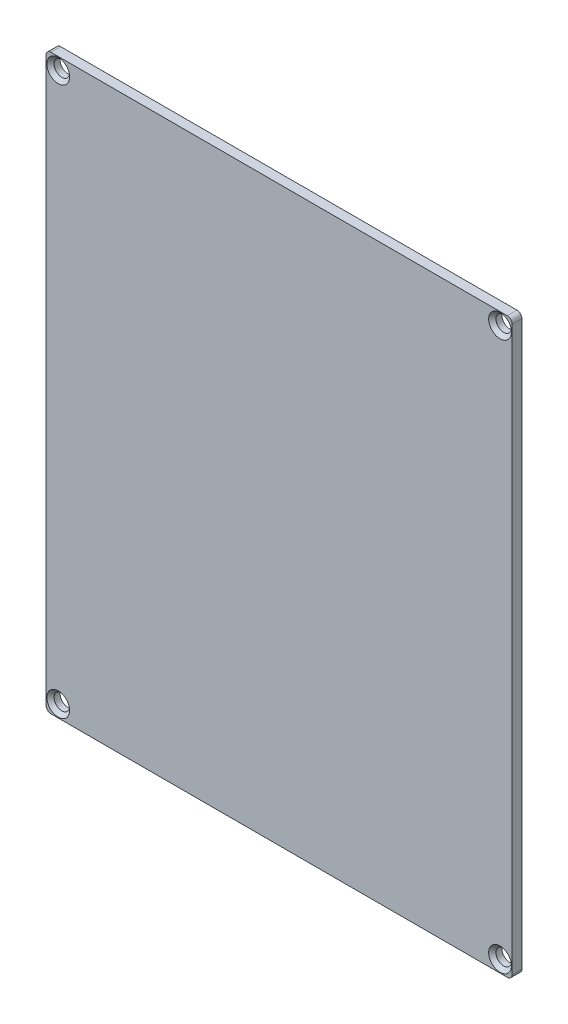
ISO-10303-21;
HEADER;
FILE_DESCRIPTION(('STEP AP214'),'2;1');
FILE_NAME('part.step','',(''),(''),'','','');
FILE_SCHEMA(('AUTOMOTIVE_DESIGN { 1 0 10303 214 1 1 1 1 }'));
ENDSEC;
DATA;
#1=APPLICATION_CONTEXT('core data for automotive mechanical design processes');
#2=APPLICATION_PROTOCOL_DEFINITION('international standard','automotive_design',2000,#1);
#3=PRODUCT_CONTEXT('',#1,'mechanical');
#4=PRODUCT('Part','Part','',(#3));
#5=PRODUCT_RELATED_PRODUCT_CATEGORY('part','',(#4));
#6=PRODUCT_DEFINITION_FORMATION('','',#4);
#7=PRODUCT_DEFINITION_CONTEXT('part definition',#1,'design');
#8=PRODUCT_DEFINITION('design','',#6,#7);
#9=PRODUCT_DEFINITION_SHAPE('','',#8);
#10=(LENGTH_UNIT() NAMED_UNIT(*) SI_UNIT(.MILLI.,.METRE.));
#11=(NAMED_UNIT(*) PLANE_ANGLE_UNIT() SI_UNIT($,.RADIAN.));
#12=(NAMED_UNIT(*) SI_UNIT($,.STERADIAN.) SOLID_ANGLE_UNIT());
#13=UNCERTAINTY_MEASURE_WITH_UNIT(LENGTH_MEASURE(1.E-05),#10,'distance_accuracy_value','');
#14=(GEOMETRIC_REPRESENTATION_CONTEXT(3) GLOBAL_UNCERTAINTY_ASSIGNED_CONTEXT((#13)) GLOBAL_UNIT_ASSIGNED_CONTEXT((#10,
#11,#12)) REPRESENTATION_CONTEXT('',''));
#15=CARTESIAN_POINT('',(0.,0.,0.));
#16=DIRECTION('',(0.,0.,1.));
#17=DIRECTION('',(1.,0.,0.));
#18=AXIS2_PLACEMENT_3D('',#15,#16,#17);
#19=CARTESIAN_POINT('',(0.,0.,2.));
#20=DIRECTION('',(0.,0.,-1.));
#21=DIRECTION('',(-1.,0.,0.));
#22=AXIS2_PLACEMENT_3D('',#19,#20,#21);
#23=PLANE('',#22);
#24=CARTESIAN_POINT('',(45.5,-56.5,2.));
#25=DIRECTION('',(0.,0.,-1.));
#26=DIRECTION('',(-1.,0.,0.));
#27=AXIS2_PLACEMENT_3D('',#24,#25,#26);
#28=CIRCLE('',#27,2.35000000000003);
#29=CARTESIAN_POINT('',(47.85,-56.5,2.));
#30=VERTEX_POINT('',#29);
#31=EDGE_CURVE('E148',#30,#30,#28,.T.);
#32=ORIENTED_EDGE('',*,*,#31,.T.);
#33=EDGE_LOOP('',(#32));
#34=FACE_BOUND('',#33,.T.);
#35=CARTESIAN_POINT('',(-45.5,-56.5,2.));
#36=DIRECTION('',(0.,0.,-1.));
#37=DIRECTION('',(-1.,0.,0.));
#38=AXIS2_PLACEMENT_3D('',#35,#36,#37);
#39=CIRCLE('',#38,2.35000000000003);
#40=CARTESIAN_POINT('',(-43.15,-56.5,2.));
#41=VERTEX_POINT('',#40);
#42=EDGE_CURVE('E145',#41,#41,#39,.T.);
#43=ORIENTED_EDGE('',*,*,#42,.T.);
#44=EDGE_LOOP('',(#43));
#45=FACE_BOUND('',#44,.T.);
#46=CARTESIAN_POINT('',(-45.5,56.5,2.));
#47=DIRECTION('',(0.,0.,-1.));
#48=DIRECTION('',(-1.,0.,0.));
#49=AXIS2_PLACEMENT_3D('',#46,#47,#48);
#50=CIRCLE('',#49,2.35000000000003);
#51=CARTESIAN_POINT('',(-43.15,56.5,2.));
#52=VERTEX_POINT('',#51);
#53=EDGE_CURVE('E142',#52,#52,#50,.T.);
#54=ORIENTED_EDGE('',*,*,#53,.T.);
#55=EDGE_LOOP('',(#54));
#56=FACE_BOUND('',#55,.T.);
#57=CARTESIAN_POINT('',(45.5,56.5,2.));
#58=DIRECTION('',(0.,0.,-1.));
#59=DIRECTION('',(-1.,0.,0.));
#60=AXIS2_PLACEMENT_3D('',#57,#58,#59);
#61=CIRCLE('',#60,2.35000000000003);
#62=CARTESIAN_POINT('',(47.85,56.5,2.));
#63=VERTEX_POINT('',#62);
#64=EDGE_CURVE('E139',#63,#63,#61,.T.);
#65=ORIENTED_EDGE('',*,*,#64,.T.);
#66=EDGE_LOOP('',(#65));
#67=FACE_BOUND('',#66,.T.);
#68=DIRECTION('',(0.,-1.,0.));
#69=VECTOR('',#68,1.);
#70=CARTESIAN_POINT('',(-48.,-59.,2.));
#71=LINE('',#70,#69);
#72=CARTESIAN_POINT('',(-48.,58.,2.));
#73=VERTEX_POINT('',#72);
#74=CARTESIAN_POINT('',(-48.,-58.,2.));
#75=VERTEX_POINT('',#74);
#76=EDGE_CURVE('E196',#73,#75,#71,.T.);
#77=ORIENTED_EDGE('',*,*,#76,.T.);
#78=CARTESIAN_POINT('',(-47.,-58.,2.));
#79=DIRECTION('',(0.,0.,-1.));
#80=DIRECTION('',(-1.,0.,0.));
#81=AXIS2_PLACEMENT_3D('',#78,#79,#80);
#82=CIRCLE('',#81,1.);
#83=CARTESIAN_POINT('',(-47.,-59.,2.));
#84=VERTEX_POINT('',#83);
#85=EDGE_CURVE('E173',#75,#84,#82,.F.);
#86=ORIENTED_EDGE('',*,*,#85,.T.);
#87=DIRECTION('',(1.,0.,0.));
#88=VECTOR('',#87,1.);
#89=CARTESIAN_POINT('',(-48.,-59.,2.));
#90=LINE('',#89,#88);
#91=CARTESIAN_POINT('',(47.,-59.,2.));
#92=VERTEX_POINT('',#91);
#93=EDGE_CURVE('E120',#84,#92,#90,.T.);
#94=ORIENTED_EDGE('',*,*,#93,.T.);
#95=CARTESIAN_POINT('',(47.,-58.,2.));
#96=DIRECTION('',(0.,0.,-1.));
#97=DIRECTION('',(-1.,0.,0.));
#98=AXIS2_PLACEMENT_3D('',#95,#96,#97);
#99=CIRCLE('',#98,1.);
#100=CARTESIAN_POINT('',(48.,-58.,2.));
#101=VERTEX_POINT('',#100);
#102=EDGE_CURVE('E171',#92,#101,#99,.F.);
#103=ORIENTED_EDGE('',*,*,#102,.T.);
#104=DIRECTION('',(0.,1.,0.));
#105=VECTOR('',#104,1.);
#106=CARTESIAN_POINT('',(48.,-59.,2.));
#107=LINE('',#106,#105);
#108=CARTESIAN_POINT('',(48.,58.,2.));
#109=VERTEX_POINT('',#108);
#110=EDGE_CURVE('E127',#101,#109,#107,.T.);
#111=ORIENTED_EDGE('',*,*,#110,.T.);
#112=CARTESIAN_POINT('',(47.,58.,2.));
#113=DIRECTION('',(0.,0.,-1.));
#114=DIRECTION('',(-1.,0.,0.));
#115=AXIS2_PLACEMENT_3D('',#112,#113,#114);
#116=CIRCLE('',#115,1.);
#117=CARTESIAN_POINT('',(47.,59.,2.));
#118=VERTEX_POINT('',#117);
#119=EDGE_CURVE('E55',#109,#118,#116,.F.);
#120=ORIENTED_EDGE('',*,*,#119,.T.);
#121=DIRECTION('',(-1.,0.,0.));
#122=VECTOR('',#121,1.);
#123=CARTESIAN_POINT('',(-48.,59.,2.));
#124=LINE('',#123,#122);
#125=CARTESIAN_POINT('',(-47.,59.,2.));
#126=VERTEX_POINT('',#125);
#127=EDGE_CURVE('E130',#118,#126,#124,.T.);
#128=ORIENTED_EDGE('',*,*,#127,.T.);
#129=CARTESIAN_POINT('',(-47.,58.,2.));
#130=DIRECTION('',(0.,0.,-1.));
#131=DIRECTION('',(-1.,0.,0.));
#132=AXIS2_PLACEMENT_3D('',#129,#130,#131);
#133=CIRCLE('',#132,1.);
#134=EDGE_CURVE('E168',#126,#73,#133,.F.);
#135=ORIENTED_EDGE('',*,*,#134,.T.);
#136=EDGE_LOOP('',(#77,#86,#94,#103,#111,#120,#128,#135));
#137=FACE_BOUND('',#136,.T.);
#138=ADVANCED_FACE('F34',(#34,#45,#56,#67,#137),#23,.F.);
#139=CARTESIAN_POINT('',(0.,0.,0.));
#140=DIRECTION('',(0.,0.,-1.));
#141=DIRECTION('',(-1.,0.,0.));
#142=AXIS2_PLACEMENT_3D('',#139,#140,#141);
#143=PLANE('',#142);
#144=CARTESIAN_POINT('',(45.5,-56.5,0.));
#145=DIRECTION('',(0.,0.,1.));
#146=DIRECTION('',(1.,0.,0.));
#147=AXIS2_PLACEMENT_3D('',#144,#145,#146);
#148=CIRCLE('',#147,1.6);
#149=CARTESIAN_POINT('',(47.1,-56.5,0.));
#150=VERTEX_POINT('',#149);
#151=EDGE_CURVE('E202',#150,#150,#148,.T.);
#152=ORIENTED_EDGE('',*,*,#151,.T.);
#153=EDGE_LOOP('',(#152));
#154=FACE_BOUND('',#153,.T.);
#155=CARTESIAN_POINT('',(-45.5,56.5,0.));
#156=DIRECTION('',(0.,0.,1.));
#157=DIRECTION('',(1.,0.,0.));
#158=AXIS2_PLACEMENT_3D('',#155,#156,#157);
#159=CIRCLE('',#158,1.6);
#160=CARTESIAN_POINT('',(-43.9,56.5,0.));
#161=VERTEX_POINT('',#160);
#162=EDGE_CURVE('E189',#161,#161,#159,.T.);
#163=ORIENTED_EDGE('',*,*,#162,.T.);
#164=EDGE_LOOP('',(#163));
#165=FACE_BOUND('',#164,.T.);
#166=DIRECTION('',(1.,0.,0.));
#167=VECTOR('',#166,1.);
#168=CARTESIAN_POINT('',(-48.,-59.,0.));
#169=LINE('',#168,#167);
#170=CARTESIAN_POINT('',(-47.,-59.,0.));
#171=VERTEX_POINT('',#170);
#172=CARTESIAN_POINT('',(47.,-59.,0.));
#173=VERTEX_POINT('',#172);
#174=EDGE_CURVE('E117',#171,#173,#169,.T.);
#175=ORIENTED_EDGE('',*,*,#174,.F.);
#176=CARTESIAN_POINT('',(-47.,-58.,0.));
#177=DIRECTION('',(0.,0.,-1.));
#178=DIRECTION('',(-1.,0.,0.));
#179=AXIS2_PLACEMENT_3D('',#176,#177,#178);
#180=CIRCLE('',#179,1.);
#181=CARTESIAN_POINT('',(-48.,-58.,0.));
#182=VERTEX_POINT('',#181);
#183=EDGE_CURVE('E100',#171,#182,#180,.T.);
#184=ORIENTED_EDGE('',*,*,#183,.T.);
#185=DIRECTION('',(0.,-1.,0.));
#186=VECTOR('',#185,1.);
#187=CARTESIAN_POINT('',(-48.,-59.,0.));
#188=LINE('',#187,#186);
#189=CARTESIAN_POINT('',(-48.,58.,0.));
#190=VERTEX_POINT('',#189);
#191=EDGE_CURVE('E128',#190,#182,#188,.T.);
#192=ORIENTED_EDGE('',*,*,#191,.F.);
#193=CARTESIAN_POINT('',(-47.,58.,0.));
#194=DIRECTION('',(0.,0.,-1.));
#195=DIRECTION('',(-1.,0.,0.));
#196=AXIS2_PLACEMENT_3D('',#193,#194,#195);
#197=CIRCLE('',#196,1.);
#198=CARTESIAN_POINT('',(-47.,59.,0.));
#199=VERTEX_POINT('',#198);
#200=EDGE_CURVE('E121',#190,#199,#197,.T.);
#201=ORIENTED_EDGE('',*,*,#200,.T.);
#202=DIRECTION('',(-1.,0.,0.));
#203=VECTOR('',#202,1.);
#204=CARTESIAN_POINT('',(-48.,59.,0.));
#205=LINE('',#204,#203);
#206=CARTESIAN_POINT('',(47.,59.,0.));
#207=VERTEX_POINT('',#206);
#208=EDGE_CURVE('E132',#207,#199,#205,.T.);
#209=ORIENTED_EDGE('',*,*,#208,.F.);
#210=CARTESIAN_POINT('',(47.,58.,0.));
#211=DIRECTION('',(0.,0.,-1.));
#212=DIRECTION('',(-1.,0.,0.));
#213=AXIS2_PLACEMENT_3D('',#210,#211,#212);
#214=CIRCLE('',#213,1.);
#215=CARTESIAN_POINT('',(48.,58.,0.));
#216=VERTEX_POINT('',#215);
#217=EDGE_CURVE('E162',#207,#216,#214,.T.);
#218=ORIENTED_EDGE('',*,*,#217,.T.);
#219=DIRECTION('',(0.,1.,0.));
#220=VECTOR('',#219,1.);
#221=CARTESIAN_POINT('',(48.,-59.,0.));
#222=LINE('',#221,#220);
#223=CARTESIAN_POINT('',(48.,-58.,0.));
#224=VERTEX_POINT('',#223);
#225=EDGE_CURVE('E184',#224,#216,#222,.T.);
#226=ORIENTED_EDGE('',*,*,#225,.F.);
#227=CARTESIAN_POINT('',(47.,-58.,0.));
#228=DIRECTION('',(0.,0.,-1.));
#229=DIRECTION('',(-1.,0.,0.));
#230=AXIS2_PLACEMENT_3D('',#227,#228,#229);
#231=CIRCLE('',#230,1.);
#232=EDGE_CURVE('E111',#224,#173,#231,.T.);
#233=ORIENTED_EDGE('',*,*,#232,.T.);
#234=EDGE_LOOP('',(#175,#184,#192,#201,#209,#218,#226,#233));
#235=FACE_BOUND('',#234,.T.);
#236=CARTESIAN_POINT('',(45.5,56.5,0.));
#237=DIRECTION('',(0.,0.,1.));
#238=DIRECTION('',(1.,0.,0.));
#239=AXIS2_PLACEMENT_3D('',#236,#237,#238);
#240=CIRCLE('',#239,1.6);
#241=CARTESIAN_POINT('',(47.1,56.5,0.));
#242=VERTEX_POINT('',#241);
#243=EDGE_CURVE('E192',#242,#242,#240,.T.);
#244=ORIENTED_EDGE('',*,*,#243,.T.);
#245=EDGE_LOOP('',(#244));
#246=FACE_BOUND('',#245,.T.);
#247=CARTESIAN_POINT('',(-45.5,-56.5,0.));
#248=DIRECTION('',(0.,0.,1.));
#249=DIRECTION('',(1.,0.,0.));
#250=AXIS2_PLACEMENT_3D('',#247,#248,#249);
#251=CIRCLE('',#250,1.6);
#252=CARTESIAN_POINT('',(-43.9,-56.5,0.));
#253=VERTEX_POINT('',#252);
#254=EDGE_CURVE('E205',#253,#253,#251,.T.);
#255=ORIENTED_EDGE('',*,*,#254,.T.);
#256=EDGE_LOOP('',(#255));
#257=FACE_BOUND('',#256,.T.);
#258=ADVANCED_FACE('F124',(#154,#165,#235,#246,#257),#143,.T.);
#259=CARTESIAN_POINT('',(48.,-59.,2.));
#260=DIRECTION('',(-1.,0.,0.));
#261=DIRECTION('',(0.,0.,1.));
#262=AXIS2_PLACEMENT_3D('',#259,#260,#261);
#263=PLANE('',#262);
#264=ORIENTED_EDGE('',*,*,#110,.F.);
#265=DIRECTION('',(0.,0.,-1.));
#266=VECTOR('',#265,1.);
#267=CARTESIAN_POINT('',(48.,-58.,2.));
#268=LINE('',#267,#266);
#269=EDGE_CURVE('E177',#101,#224,#268,.T.);
#270=ORIENTED_EDGE('',*,*,#269,.T.);
#271=ORIENTED_EDGE('',*,*,#225,.T.);
#272=DIRECTION('',(0.,0.,-1.));
#273=VECTOR('',#272,1.);
#274=CARTESIAN_POINT('',(48.,58.,2.));
#275=LINE('',#274,#273);
#276=EDGE_CURVE('E175',#216,#109,#275,.F.);
#277=ORIENTED_EDGE('',*,*,#276,.T.);
#278=EDGE_LOOP('',(#264,#270,#271,#277));
#279=FACE_BOUND('',#278,.T.);
#280=ADVANCED_FACE('F183',(#279),#263,.F.);
#281=CARTESIAN_POINT('',(-48.,59.,2.));
#282=DIRECTION('',(0.,-1.,0.));
#283=DIRECTION('',(0.,0.,-1.));
#284=AXIS2_PLACEMENT_3D('',#281,#282,#283);
#285=PLANE('',#284);
#286=ORIENTED_EDGE('',*,*,#127,.F.);
#287=DIRECTION('',(0.,0.,-1.));
#288=VECTOR('',#287,1.);
#289=CARTESIAN_POINT('',(47.,59.,2.));
#290=LINE('',#289,#288);
#291=EDGE_CURVE('E11',#118,#207,#290,.T.);
#292=ORIENTED_EDGE('',*,*,#291,.T.);
#293=ORIENTED_EDGE('',*,*,#208,.T.);
#294=DIRECTION('',(0.,0.,-1.));
#295=VECTOR('',#294,1.);
#296=CARTESIAN_POINT('',(-47.,59.,2.));
#297=LINE('',#296,#295);
#298=EDGE_CURVE('E42',#199,#126,#297,.F.);
#299=ORIENTED_EDGE('',*,*,#298,.T.);
#300=EDGE_LOOP('',(#286,#292,#293,#299));
#301=FACE_BOUND('',#300,.T.);
#302=ADVANCED_FACE('F244',(#301),#285,.F.);
#303=CARTESIAN_POINT('',(-48.,-59.,2.));
#304=DIRECTION('',(1.,0.,0.));
#305=DIRECTION('',(0.,0.,-1.));
#306=AXIS2_PLACEMENT_3D('',#303,#304,#305);
#307=PLANE('',#306);
#308=ORIENTED_EDGE('',*,*,#191,.T.);
#309=DIRECTION('',(0.,0.,-1.));
#310=VECTOR('',#309,1.);
#311=CARTESIAN_POINT('',(-48.,-58.,2.));
#312=LINE('',#311,#310);
#313=EDGE_CURVE('E105',#182,#75,#312,.F.);
#314=ORIENTED_EDGE('',*,*,#313,.T.);
#315=ORIENTED_EDGE('',*,*,#76,.F.);
#316=DIRECTION('',(0.,0.,-1.));
#317=VECTOR('',#316,1.);
#318=CARTESIAN_POINT('',(-48.,58.,2.));
#319=LINE('',#318,#317);
#320=EDGE_CURVE('E110',#73,#190,#319,.T.);
#321=ORIENTED_EDGE('',*,*,#320,.T.);
#322=EDGE_LOOP('',(#308,#314,#315,#321));
#323=FACE_BOUND('',#322,.T.);
#324=ADVANCED_FACE('F241',(#323),#307,.F.);
#325=CARTESIAN_POINT('',(-48.,-59.,2.));
#326=DIRECTION('',(0.,1.,0.));
#327=DIRECTION('',(0.,0.,1.));
#328=AXIS2_PLACEMENT_3D('',#325,#326,#327);
#329=PLANE('',#328);
#330=ORIENTED_EDGE('',*,*,#93,.F.);
#331=DIRECTION('',(0.,0.,-1.));
#332=VECTOR('',#331,1.);
#333=CARTESIAN_POINT('',(-47.,-59.,2.));
#334=LINE('',#333,#332);
#335=EDGE_CURVE('E104',#84,#171,#334,.T.);
#336=ORIENTED_EDGE('',*,*,#335,.T.);
#337=ORIENTED_EDGE('',*,*,#174,.T.);
#338=DIRECTION('',(0.,0.,-1.));
#339=VECTOR('',#338,1.);
#340=CARTESIAN_POINT('',(47.,-59.,2.));
#341=LINE('',#340,#339);
#342=EDGE_CURVE('E122',#173,#92,#341,.F.);
#343=ORIENTED_EDGE('',*,*,#342,.T.);
#344=EDGE_LOOP('',(#330,#336,#337,#343));
#345=FACE_BOUND('',#344,.T.);
#346=ADVANCED_FACE('F116',(#345),#329,.F.);
#347=CARTESIAN_POINT('',(-45.5,56.5,2.));
#348=DIRECTION('',(0.,0.,-1.));
#349=DIRECTION('',(-1.,0.,0.));
#350=AXIS2_PLACEMENT_3D('',#347,#348,#349);
#351=CYLINDRICAL_SURFACE('',#350,1.6);
#352=CARTESIAN_POINT('',(-45.5,56.5,1.24999999999996));
#353=DIRECTION('',(0.,0.,-1.));
#354=DIRECTION('',(-1.,0.,0.));
#355=AXIS2_PLACEMENT_3D('',#352,#353,#354);
#356=CIRCLE('',#355,1.6);
#357=CARTESIAN_POINT('',(-43.9,56.5,1.24999999999996));
#358=VERTEX_POINT('',#357);
#359=EDGE_CURVE('E154',#358,#358,#356,.F.);
#360=ORIENTED_EDGE('',*,*,#359,.T.);
#361=EDGE_LOOP('',(#360));
#362=FACE_BOUND('',#361,.T.);
#363=ORIENTED_EDGE('',*,*,#162,.F.);
#364=EDGE_LOOP('',(#363));
#365=FACE_BOUND('',#364,.T.);
#366=ADVANCED_FACE('F236',(#362,#365),#351,.F.);
#367=CARTESIAN_POINT('',(45.5,56.5,2.));
#368=DIRECTION('',(0.,0.,-1.));
#369=DIRECTION('',(-1.,0.,0.));
#370=AXIS2_PLACEMENT_3D('',#367,#368,#369);
#371=CYLINDRICAL_SURFACE('',#370,1.6);
#372=CARTESIAN_POINT('',(45.5,56.5,1.24999999999996));
#373=DIRECTION('',(0.,0.,-1.));
#374=DIRECTION('',(-1.,0.,0.));
#375=AXIS2_PLACEMENT_3D('',#372,#373,#374);
#376=CIRCLE('',#375,1.6);
#377=CARTESIAN_POINT('',(47.1,56.5,1.24999999999996));
#378=VERTEX_POINT('',#377);
#379=EDGE_CURVE('E157',#378,#378,#376,.F.);
#380=ORIENTED_EDGE('',*,*,#379,.T.);
#381=EDGE_LOOP('',(#380));
#382=FACE_BOUND('',#381,.T.);
#383=ORIENTED_EDGE('',*,*,#243,.F.);
#384=EDGE_LOOP('',(#383));
#385=FACE_BOUND('',#384,.T.);
#386=ADVANCED_FACE('F223',(#382,#385),#371,.F.);
#387=CARTESIAN_POINT('',(45.5,-56.5,2.));
#388=DIRECTION('',(0.,0.,-1.));
#389=DIRECTION('',(-1.,0.,0.));
#390=AXIS2_PLACEMENT_3D('',#387,#388,#389);
#391=CYLINDRICAL_SURFACE('',#390,1.6);
#392=CARTESIAN_POINT('',(45.5,-56.5,1.24999999999996));
#393=DIRECTION('',(0.,0.,-1.));
#394=DIRECTION('',(-1.,0.,0.));
#395=AXIS2_PLACEMENT_3D('',#392,#393,#394);
#396=CIRCLE('',#395,1.6);
#397=CARTESIAN_POINT('',(47.1,-56.5,1.24999999999996));
#398=VERTEX_POINT('',#397);
#399=EDGE_CURVE('E136',#398,#398,#396,.F.);
#400=ORIENTED_EDGE('',*,*,#399,.T.);
#401=EDGE_LOOP('',(#400));
#402=FACE_BOUND('',#401,.T.);
#403=ORIENTED_EDGE('',*,*,#151,.F.);
#404=EDGE_LOOP('',(#403));
#405=FACE_BOUND('',#404,.T.);
#406=ADVANCED_FACE('F213',(#402,#405),#391,.F.);
#407=CARTESIAN_POINT('',(-45.5,-56.5,2.));
#408=DIRECTION('',(0.,0.,-1.));
#409=DIRECTION('',(-1.,0.,0.));
#410=AXIS2_PLACEMENT_3D('',#407,#408,#409);
#411=CYLINDRICAL_SURFACE('',#410,1.6);
#412=CARTESIAN_POINT('',(-45.5,-56.5,1.24999999999996));
#413=DIRECTION('',(0.,0.,-1.));
#414=DIRECTION('',(-1.,0.,0.));
#415=AXIS2_PLACEMENT_3D('',#412,#413,#414);
#416=CIRCLE('',#415,1.6);
#417=CARTESIAN_POINT('',(-43.9,-56.5,1.24999999999996));
#418=VERTEX_POINT('',#417);
#419=EDGE_CURVE('E151',#418,#418,#416,.F.);
#420=ORIENTED_EDGE('',*,*,#419,.T.);
#421=EDGE_LOOP('',(#420));
#422=FACE_BOUND('',#421,.T.);
#423=ORIENTED_EDGE('',*,*,#254,.F.);
#424=EDGE_LOOP('',(#423));
#425=FACE_BOUND('',#424,.T.);
#426=ADVANCED_FACE('F210',(#422,#425),#411,.F.);
#427=CARTESIAN_POINT('',(45.5,-56.5,1.24999999999996));
#428=DIRECTION('',(0.,0.,1.));
#429=DIRECTION('',(1.,0.,0.));
#430=AXIS2_PLACEMENT_3D('',#427,#428,#429);
#431=CONICAL_SURFACE('',#430,1.6,0.785398163397445);
#432=CARTESIAN_POINT('',(47.85,-56.5,2.));
#433=CARTESIAN_POINT('',(47.8421875,-56.5,1.9921875));
#434=CARTESIAN_POINT('',(47.834375,-56.5,1.984375));
#435=CARTESIAN_POINT('',(47.81875,-56.5,1.96875));
#436=CARTESIAN_POINT('',(47.8109375,-56.5,1.9609375));
#437=CARTESIAN_POINT('',(47.7953125,-56.5,1.9453125));
#438=CARTESIAN_POINT('',(47.7875,-56.5,1.9375));
#439=CARTESIAN_POINT('',(47.771875,-56.5,1.921875));
#440=CARTESIAN_POINT('',(47.7640625,-56.5,1.9140625));
#441=CARTESIAN_POINT('',(47.7484375,-56.5,1.89843749999999));
#442=CARTESIAN_POINT('',(47.740625,-56.5,1.89062499999999));
#443=CARTESIAN_POINT('',(47.725,-56.5,1.87499999999999));
#444=CARTESIAN_POINT('',(47.7171875,-56.5,1.86718749999999));
#445=CARTESIAN_POINT('',(47.7015625,-56.5,1.85156249999999));
#446=CARTESIAN_POINT('',(47.69375,-56.5,1.84374999999999));
#447=CARTESIAN_POINT('',(47.678125,-56.5,1.82812499999999));
#448=CARTESIAN_POINT('',(47.6703125,-56.5,1.82031249999999));
#449=CARTESIAN_POINT('',(47.6546875,-56.5,1.80468749999999));
#450=CARTESIAN_POINT('',(47.646875,-56.5,1.79687499999999));
#451=CARTESIAN_POINT('',(47.63125,-56.5,1.78124999999999));
#452=CARTESIAN_POINT('',(47.6234375,-56.5,1.77343749999999));
#453=CARTESIAN_POINT('',(47.6078125,-56.5,1.75781249999999));
#454=CARTESIAN_POINT('',(47.6,-56.5,1.74999999999999));
#455=CARTESIAN_POINT('',(47.584375,-56.5,1.73437499999999));
#456=CARTESIAN_POINT('',(47.5765625,-56.5,1.72656249999999));
#457=CARTESIAN_POINT('',(47.5609375,-56.5,1.71093749999998));
#458=CARTESIAN_POINT('',(47.553125,-56.5,1.70312499999998));
#459=CARTESIAN_POINT('',(47.5375,-56.5,1.68749999999998));
#460=CARTESIAN_POINT('',(47.5296875,-56.5,1.67968749999998));
#461=CARTESIAN_POINT('',(47.5140625,-56.5,1.66406249999998));
#462=CARTESIAN_POINT('',(47.50625,-56.5,1.65624999999998));
#463=CARTESIAN_POINT('',(47.490625,-56.5,1.64062499999998));
#464=CARTESIAN_POINT('',(47.4828125,-56.5,1.63281249999998));
#465=CARTESIAN_POINT('',(47.4671875,-56.5,1.61718749999998));
#466=CARTESIAN_POINT('',(47.459375,-56.5,1.60937499999998));
#467=CARTESIAN_POINT('',(47.44375,-56.5,1.59374999999998));
#468=CARTESIAN_POINT('',(47.4359375,-56.5,1.58593749999998));
#469=CARTESIAN_POINT('',(47.4203125,-56.5,1.57031249999998));
#470=CARTESIAN_POINT('',(47.4125,-56.5,1.56249999999998));
#471=CARTESIAN_POINT('',(47.396875,-56.5,1.54687499999998));
#472=CARTESIAN_POINT('',(47.3890625,-56.5,1.53906249999998));
#473=CARTESIAN_POINT('',(47.3734375,-56.5,1.52343749999997));
#474=CARTESIAN_POINT('',(47.365625,-56.5,1.51562499999997));
#475=CARTESIAN_POINT('',(47.35,-56.5,1.49999999999997));
#476=CARTESIAN_POINT('',(47.3421875,-56.5,1.49218749999997));
#477=CARTESIAN_POINT('',(47.3265625,-56.5,1.47656249999997));
#478=CARTESIAN_POINT('',(47.31875,-56.5,1.46874999999997));
#479=CARTESIAN_POINT('',(47.303125,-56.5,1.45312499999997));
#480=CARTESIAN_POINT('',(47.2953125,-56.5,1.44531249999997));
#481=CARTESIAN_POINT('',(47.2796875,-56.5,1.42968749999997));
#482=CARTESIAN_POINT('',(47.271875,-56.5,1.42187499999997));
#483=CARTESIAN_POINT('',(47.25625,-56.5,1.40624999999997));
#484=CARTESIAN_POINT('',(47.2484375,-56.5,1.39843749999997));
#485=CARTESIAN_POINT('',(47.2328125,-56.5,1.38281249999997));
#486=CARTESIAN_POINT('',(47.225,-56.5,1.37499999999997));
#487=CARTESIAN_POINT('',(47.209375,-56.5,1.35937499999997));
#488=CARTESIAN_POINT('',(47.2015625,-56.5,1.35156249999996));
#489=CARTESIAN_POINT('',(47.1859375,-56.5,1.33593749999996));
#490=CARTESIAN_POINT('',(47.178125,-56.5,1.32812499999996));
#491=CARTESIAN_POINT('',(47.1625,-56.5,1.31249999999996));
#492=CARTESIAN_POINT('',(47.1546875,-56.5,1.30468749999996));
#493=CARTESIAN_POINT('',(47.1390625,-56.5,1.28906249999996));
#494=CARTESIAN_POINT('',(47.13125,-56.5,1.28124999999996));
#495=CARTESIAN_POINT('',(47.115625,-56.5,1.26562499999996));
#496=CARTESIAN_POINT('',(47.1078125,-56.5,1.25781249999996));
#497=CARTESIAN_POINT('',(47.1,-56.5,1.24999999999996));
#498=B_SPLINE_CURVE_WITH_KNOTS('',3,(#432,#433,#434,#435,#436,#437,#438,#439,#440,#441,#442,
#443,#444,#445,#446,#447,#448,#449,#450,#451,#452,#453,#454,#455,#456,#457,#458,#459,#460,#461,
#462,#463,#464,#465,#466,#467,#468,#469,#470,#471,#472,#473,#474,#475,#476,#477,#478,#479,#480,
#481,#482,#483,#484,#485,#486,#487,#488,#489,#490,#491,#492,#493,#494,#495,#496,#497),
.UNSPECIFIED.,.F.,.F.,(4,2,2,2,2,2,2,2,2,2,2,2,2,2,2,2,2,2,2,2,2,2,2,2,2,2,2,2,2,2,2,2,4),(0.,
0.033145630368121,0.066291260736242,0.0994368911043629,0.132582521472484,0.165728151840605,
0.198873782208726,0.232019412576847,0.265165042944968,0.298310673313089,0.331456303681209,
0.36460193404933,0.397747564417451,0.430893194785572,0.464038825153693,0.497184455521814,
0.530330085889935,0.563475716258056,0.596621346626177,0.629766976994303,0.662912607362424,
0.696058237730545,0.729203868098666,0.762349498466787,0.795495128834908,0.828640759203029,
0.86178638957115,0.894932019939271,0.928077650307392,0.961223280675513,0.994368911043634,
1.02751454141176,1.06066017177988),.UNSPECIFIED.);
#499=EDGE_CURVE('BSEAM212',#30,#398,#498,.T.);
#500=ORIENTED_EDGE('',*,*,#31,.F.);
#501=ORIENTED_EDGE('',*,*,#399,.F.);
#502=ORIENTED_EDGE('',*,*,#499,.T.);
#503=ORIENTED_EDGE('',*,*,#499,.F.);
#504=EDGE_LOOP('',(#500,#502,#501,#503));
#505=FACE_BOUND('',#504,.T.);
#506=ADVANCED_FACE('F212',(#505),#431,.F.);
#507=CARTESIAN_POINT('',(-45.5,-56.5,1.24999999999996));
#508=DIRECTION('',(0.,0.,1.));
#509=DIRECTION('',(1.,0.,0.));
#510=AXIS2_PLACEMENT_3D('',#507,#508,#509);
#511=CONICAL_SURFACE('',#510,1.6,0.785398163397445);
#512=CARTESIAN_POINT('',(-43.15,-56.5,2.));
#513=CARTESIAN_POINT('',(-43.1578125,-56.5,1.9921875));
#514=CARTESIAN_POINT('',(-43.165625,-56.5,1.984375));
#515=CARTESIAN_POINT('',(-43.18125,-56.5,1.96875));
#516=CARTESIAN_POINT('',(-43.1890625,-56.5,1.9609375));
#517=CARTESIAN_POINT('',(-43.2046875,-56.5,1.9453125));
#518=CARTESIAN_POINT('',(-43.2125,-56.5,1.9375));
#519=CARTESIAN_POINT('',(-43.228125,-56.5,1.921875));
#520=CARTESIAN_POINT('',(-43.2359375,-56.5,1.9140625));
#521=CARTESIAN_POINT('',(-43.2515625,-56.5,1.89843749999999));
#522=CARTESIAN_POINT('',(-43.259375,-56.5,1.89062499999999));
#523=CARTESIAN_POINT('',(-43.275,-56.5,1.87499999999999));
#524=CARTESIAN_POINT('',(-43.2828125,-56.5,1.86718749999999));
#525=CARTESIAN_POINT('',(-43.2984375,-56.5,1.85156249999999));
#526=CARTESIAN_POINT('',(-43.30625,-56.5,1.84374999999999));
#527=CARTESIAN_POINT('',(-43.321875,-56.5,1.82812499999999));
#528=CARTESIAN_POINT('',(-43.3296875,-56.5,1.82031249999999));
#529=CARTESIAN_POINT('',(-43.3453125,-56.5,1.80468749999999));
#530=CARTESIAN_POINT('',(-43.353125,-56.5,1.79687499999999));
#531=CARTESIAN_POINT('',(-43.36875,-56.5,1.78124999999999));
#532=CARTESIAN_POINT('',(-43.3765625,-56.5,1.77343749999999));
#533=CARTESIAN_POINT('',(-43.3921875,-56.5,1.75781249999999));
#534=CARTESIAN_POINT('',(-43.4,-56.5,1.74999999999999));
#535=CARTESIAN_POINT('',(-43.415625,-56.5,1.73437499999999));
#536=CARTESIAN_POINT('',(-43.4234375,-56.5,1.72656249999999));
#537=CARTESIAN_POINT('',(-43.4390625,-56.5,1.71093749999998));
#538=CARTESIAN_POINT('',(-43.446875,-56.5,1.70312499999998));
#539=CARTESIAN_POINT('',(-43.4625,-56.5,1.68749999999998));
#540=CARTESIAN_POINT('',(-43.4703125,-56.5,1.67968749999998));
#541=CARTESIAN_POINT('',(-43.4859375,-56.5,1.66406249999998));
#542=CARTESIAN_POINT('',(-43.49375,-56.5,1.65624999999998));
#543=CARTESIAN_POINT('',(-43.509375,-56.5,1.64062499999998));
#544=CARTESIAN_POINT('',(-43.5171875,-56.5,1.63281249999998));
#545=CARTESIAN_POINT('',(-43.5328125,-56.5,1.61718749999998));
#546=CARTESIAN_POINT('',(-43.540625,-56.5,1.60937499999998));
#547=CARTESIAN_POINT('',(-43.55625,-56.5,1.59374999999998));
#548=CARTESIAN_POINT('',(-43.5640625,-56.5,1.58593749999998));
#549=CARTESIAN_POINT('',(-43.5796875,-56.5,1.57031249999998));
#550=CARTESIAN_POINT('',(-43.5875,-56.5,1.56249999999998));
#551=CARTESIAN_POINT('',(-43.603125,-56.5,1.54687499999998));
#552=CARTESIAN_POINT('',(-43.6109375,-56.5,1.53906249999998));
#553=CARTESIAN_POINT('',(-43.6265625,-56.5,1.52343749999997));
#554=CARTESIAN_POINT('',(-43.634375,-56.5,1.51562499999997));
#555=CARTESIAN_POINT('',(-43.65,-56.5,1.49999999999997));
#556=CARTESIAN_POINT('',(-43.6578125,-56.5,1.49218749999997));
#557=CARTESIAN_POINT('',(-43.6734375,-56.5,1.47656249999997));
#558=CARTESIAN_POINT('',(-43.68125,-56.5,1.46874999999997));
#559=CARTESIAN_POINT('',(-43.696875,-56.5,1.45312499999997));
#560=CARTESIAN_POINT('',(-43.7046875,-56.5,1.44531249999997));
#561=CARTESIAN_POINT('',(-43.7203125,-56.5,1.42968749999997));
#562=CARTESIAN_POINT('',(-43.728125,-56.5,1.42187499999997));
#563=CARTESIAN_POINT('',(-43.74375,-56.5,1.40624999999997));
#564=CARTESIAN_POINT('',(-43.7515625,-56.5,1.39843749999997));
#565=CARTESIAN_POINT('',(-43.7671875,-56.5,1.38281249999997));
#566=CARTESIAN_POINT('',(-43.775,-56.5,1.37499999999997));
#567=CARTESIAN_POINT('',(-43.790625,-56.5,1.35937499999997));
#568=CARTESIAN_POINT('',(-43.7984375,-56.5,1.35156249999996));
#569=CARTESIAN_POINT('',(-43.8140625,-56.5,1.33593749999996));
#570=CARTESIAN_POINT('',(-43.821875,-56.5,1.32812499999996));
#571=CARTESIAN_POINT('',(-43.8375,-56.5,1.31249999999996));
#572=CARTESIAN_POINT('',(-43.8453125,-56.5,1.30468749999996));
#573=CARTESIAN_POINT('',(-43.8609375,-56.5,1.28906249999996));
#574=CARTESIAN_POINT('',(-43.86875,-56.5,1.28124999999996));
#575=CARTESIAN_POINT('',(-43.884375,-56.5,1.26562499999996));
#576=CARTESIAN_POINT('',(-43.8921875,-56.5,1.25781249999996));
#577=CARTESIAN_POINT('',(-43.9,-56.5,1.24999999999996));
#578=B_SPLINE_CURVE_WITH_KNOTS('',3,(#512,#513,#514,#515,#516,#517,#518,#519,#520,#521,#522,
#523,#524,#525,#526,#527,#528,#529,#530,#531,#532,#533,#534,#535,#536,#537,#538,#539,#540,#541,
#542,#543,#544,#545,#546,#547,#548,#549,#550,#551,#552,#553,#554,#555,#556,#557,#558,#559,#560,
#561,#562,#563,#564,#565,#566,#567,#568,#569,#570,#571,#572,#573,#574,#575,#576,#577),
.UNSPECIFIED.,.F.,.F.,(4,2,2,2,2,2,2,2,2,2,2,2,2,2,2,2,2,2,2,2,2,2,2,2,2,2,2,2,2,2,2,2,4),(0.,
0.033145630368121,0.066291260736242,0.0994368911043629,0.132582521472484,0.165728151840605,
0.198873782208726,0.232019412576847,0.265165042944968,0.298310673313089,0.331456303681209,
0.36460193404933,0.397747564417451,0.430893194785572,0.464038825153693,0.497184455521814,
0.530330085889935,0.563475716258056,0.596621346626177,0.629766976994303,0.662912607362424,
0.696058237730545,0.729203868098666,0.762349498466787,0.795495128834908,0.828640759203029,
0.86178638957115,0.894932019939271,0.928077650307392,0.961223280675513,0.994368911043634,
1.02751454141176,1.06066017177988),.UNSPECIFIED.);
#579=EDGE_CURVE('BSEAM220',#41,#418,#578,.T.);
#580=ORIENTED_EDGE('',*,*,#42,.F.);
#581=ORIENTED_EDGE('',*,*,#419,.F.);
#582=ORIENTED_EDGE('',*,*,#579,.T.);
#583=ORIENTED_EDGE('',*,*,#579,.F.);
#584=EDGE_LOOP('',(#580,#582,#581,#583));
#585=FACE_BOUND('',#584,.T.);
#586=ADVANCED_FACE('F220',(#585),#511,.F.);
#587=CARTESIAN_POINT('',(-45.5,56.5,1.24999999999996));
#588=DIRECTION('',(0.,0.,1.));
#589=DIRECTION('',(1.,0.,0.));
#590=AXIS2_PLACEMENT_3D('',#587,#588,#589);
#591=CONICAL_SURFACE('',#590,1.6,0.785398163397445);
#592=CARTESIAN_POINT('',(-43.15,56.5,2.));
#593=CARTESIAN_POINT('',(-43.1578125,56.5,1.9921875));
#594=CARTESIAN_POINT('',(-43.165625,56.5,1.984375));
#595=CARTESIAN_POINT('',(-43.18125,56.5,1.96875));
#596=CARTESIAN_POINT('',(-43.1890625,56.5,1.9609375));
#597=CARTESIAN_POINT('',(-43.2046875,56.5,1.9453125));
#598=CARTESIAN_POINT('',(-43.2125,56.5,1.9375));
#599=CARTESIAN_POINT('',(-43.228125,56.5,1.921875));
#600=CARTESIAN_POINT('',(-43.2359375,56.5,1.9140625));
#601=CARTESIAN_POINT('',(-43.2515625,56.5,1.89843749999999));
#602=CARTESIAN_POINT('',(-43.259375,56.5,1.89062499999999));
#603=CARTESIAN_POINT('',(-43.275,56.5,1.87499999999999));
#604=CARTESIAN_POINT('',(-43.2828125,56.5,1.86718749999999));
#605=CARTESIAN_POINT('',(-43.2984375,56.5,1.85156249999999));
#606=CARTESIAN_POINT('',(-43.30625,56.5,1.84374999999999));
#607=CARTESIAN_POINT('',(-43.321875,56.5,1.82812499999999));
#608=CARTESIAN_POINT('',(-43.3296875,56.5,1.82031249999999));
#609=CARTESIAN_POINT('',(-43.3453125,56.5,1.80468749999999));
#610=CARTESIAN_POINT('',(-43.353125,56.5,1.79687499999999));
#611=CARTESIAN_POINT('',(-43.36875,56.5,1.78124999999999));
#612=CARTESIAN_POINT('',(-43.3765625,56.5,1.77343749999999));
#613=CARTESIAN_POINT('',(-43.3921875,56.5,1.75781249999999));
#614=CARTESIAN_POINT('',(-43.4,56.5,1.74999999999999));
#615=CARTESIAN_POINT('',(-43.415625,56.5,1.73437499999999));
#616=CARTESIAN_POINT('',(-43.4234375,56.5,1.72656249999999));
#617=CARTESIAN_POINT('',(-43.4390625,56.5,1.71093749999998));
#618=CARTESIAN_POINT('',(-43.446875,56.5,1.70312499999998));
#619=CARTESIAN_POINT('',(-43.4625,56.5,1.68749999999998));
#620=CARTESIAN_POINT('',(-43.4703125,56.5,1.67968749999998));
#621=CARTESIAN_POINT('',(-43.4859375,56.5,1.66406249999998));
#622=CARTESIAN_POINT('',(-43.49375,56.5,1.65624999999998));
#623=CARTESIAN_POINT('',(-43.509375,56.5,1.64062499999998));
#624=CARTESIAN_POINT('',(-43.5171875,56.5,1.63281249999998));
#625=CARTESIAN_POINT('',(-43.5328125,56.5,1.61718749999998));
#626=CARTESIAN_POINT('',(-43.540625,56.5,1.60937499999998));
#627=CARTESIAN_POINT('',(-43.55625,56.5,1.59374999999998));
#628=CARTESIAN_POINT('',(-43.5640625,56.5,1.58593749999998));
#629=CARTESIAN_POINT('',(-43.5796875,56.5,1.57031249999998));
#630=CARTESIAN_POINT('',(-43.5875,56.5,1.56249999999998));
#631=CARTESIAN_POINT('',(-43.603125,56.5,1.54687499999998));
#632=CARTESIAN_POINT('',(-43.6109375,56.5,1.53906249999998));
#633=CARTESIAN_POINT('',(-43.6265625,56.5,1.52343749999997));
#634=CARTESIAN_POINT('',(-43.634375,56.5,1.51562499999997));
#635=CARTESIAN_POINT('',(-43.65,56.5,1.49999999999997));
#636=CARTESIAN_POINT('',(-43.6578125,56.5,1.49218749999997));
#637=CARTESIAN_POINT('',(-43.6734375,56.5,1.47656249999997));
#638=CARTESIAN_POINT('',(-43.68125,56.5,1.46874999999997));
#639=CARTESIAN_POINT('',(-43.696875,56.5,1.45312499999997));
#640=CARTESIAN_POINT('',(-43.7046875,56.5,1.44531249999997));
#641=CARTESIAN_POINT('',(-43.7203125,56.5,1.42968749999997));
#642=CARTESIAN_POINT('',(-43.728125,56.5,1.42187499999997));
#643=CARTESIAN_POINT('',(-43.74375,56.5,1.40624999999997));
#644=CARTESIAN_POINT('',(-43.7515625,56.5,1.39843749999997));
#645=CARTESIAN_POINT('',(-43.7671875,56.5,1.38281249999997));
#646=CARTESIAN_POINT('',(-43.775,56.5,1.37499999999997));
#647=CARTESIAN_POINT('',(-43.790625,56.5,1.35937499999997));
#648=CARTESIAN_POINT('',(-43.7984375,56.5,1.35156249999996));
#649=CARTESIAN_POINT('',(-43.8140625,56.5,1.33593749999996));
#650=CARTESIAN_POINT('',(-43.821875,56.5,1.32812499999996));
#651=CARTESIAN_POINT('',(-43.8375,56.5,1.31249999999996));
#652=CARTESIAN_POINT('',(-43.8453125,56.5,1.30468749999996));
#653=CARTESIAN_POINT('',(-43.8609375,56.5,1.28906249999996));
#654=CARTESIAN_POINT('',(-43.86875,56.5,1.28124999999996));
#655=CARTESIAN_POINT('',(-43.884375,56.5,1.26562499999996));
#656=CARTESIAN_POINT('',(-43.8921875,56.5,1.25781249999996));
#657=CARTESIAN_POINT('',(-43.9,56.5,1.24999999999996));
#658=B_SPLINE_CURVE_WITH_KNOTS('',3,(#592,#593,#594,#595,#596,#597,#598,#599,#600,#601,#602,
#603,#604,#605,#606,#607,#608,#609,#610,#611,#612,#613,#614,#615,#616,#617,#618,#619,#620,#621,
#622,#623,#624,#625,#626,#627,#628,#629,#630,#631,#632,#633,#634,#635,#636,#637,#638,#639,#640,
#641,#642,#643,#644,#645,#646,#647,#648,#649,#650,#651,#652,#653,#654,#655,#656,#657),
.UNSPECIFIED.,.F.,.F.,(4,2,2,2,2,2,2,2,2,2,2,2,2,2,2,2,2,2,2,2,2,2,2,2,2,2,2,2,2,2,2,2,4),(0.,
0.033145630368121,0.066291260736242,0.0994368911043629,0.132582521472484,0.165728151840605,
0.198873782208726,0.232019412576847,0.265165042944968,0.298310673313089,0.331456303681209,
0.36460193404933,0.397747564417451,0.430893194785572,0.464038825153693,0.497184455521814,
0.530330085889935,0.563475716258056,0.596621346626177,0.629766976994303,0.662912607362424,
0.696058237730545,0.729203868098666,0.762349498466787,0.795495128834908,0.828640759203029,
0.86178638957115,0.894932019939271,0.928077650307392,0.961223280675513,0.994368911043634,
1.02751454141176,1.06066017177988),.UNSPECIFIED.);
#659=EDGE_CURVE('BSEAM252',#52,#358,#658,.T.);
#660=ORIENTED_EDGE('',*,*,#53,.F.);
#661=ORIENTED_EDGE('',*,*,#359,.F.);
#662=ORIENTED_EDGE('',*,*,#659,.T.);
#663=ORIENTED_EDGE('',*,*,#659,.F.);
#664=EDGE_LOOP('',(#660,#662,#661,#663));
#665=FACE_BOUND('',#664,.T.);
#666=ADVANCED_FACE('F252',(#665),#591,.F.);
#667=CARTESIAN_POINT('',(45.5,56.5,1.24999999999996));
#668=DIRECTION('',(0.,0.,1.));
#669=DIRECTION('',(1.,0.,0.));
#670=AXIS2_PLACEMENT_3D('',#667,#668,#669);
#671=CONICAL_SURFACE('',#670,1.6,0.785398163397445);
#672=CARTESIAN_POINT('',(47.85,56.5,2.));
#673=CARTESIAN_POINT('',(47.8421875,56.5,1.9921875));
#674=CARTESIAN_POINT('',(47.834375,56.5,1.984375));
#675=CARTESIAN_POINT('',(47.81875,56.5,1.96875));
#676=CARTESIAN_POINT('',(47.8109375,56.5,1.9609375));
#677=CARTESIAN_POINT('',(47.7953125,56.5,1.9453125));
#678=CARTESIAN_POINT('',(47.7875,56.5,1.9375));
#679=CARTESIAN_POINT('',(47.771875,56.5,1.921875));
#680=CARTESIAN_POINT('',(47.7640625,56.5,1.9140625));
#681=CARTESIAN_POINT('',(47.7484375,56.5,1.89843749999999));
#682=CARTESIAN_POINT('',(47.740625,56.5,1.89062499999999));
#683=CARTESIAN_POINT('',(47.725,56.5,1.87499999999999));
#684=CARTESIAN_POINT('',(47.7171875,56.5,1.86718749999999));
#685=CARTESIAN_POINT('',(47.7015625,56.5,1.85156249999999));
#686=CARTESIAN_POINT('',(47.69375,56.5,1.84374999999999));
#687=CARTESIAN_POINT('',(47.678125,56.5,1.82812499999999));
#688=CARTESIAN_POINT('',(47.6703125,56.5,1.82031249999999));
#689=CARTESIAN_POINT('',(47.6546875,56.5,1.80468749999999));
#690=CARTESIAN_POINT('',(47.646875,56.5,1.79687499999999));
#691=CARTESIAN_POINT('',(47.63125,56.5,1.78124999999999));
#692=CARTESIAN_POINT('',(47.6234375,56.5,1.77343749999999));
#693=CARTESIAN_POINT('',(47.6078125,56.5,1.75781249999999));
#694=CARTESIAN_POINT('',(47.6,56.5,1.74999999999999));
#695=CARTESIAN_POINT('',(47.584375,56.5,1.73437499999999));
#696=CARTESIAN_POINT('',(47.5765625,56.5,1.72656249999999));
#697=CARTESIAN_POINT('',(47.5609375,56.5,1.71093749999998));
#698=CARTESIAN_POINT('',(47.553125,56.5,1.70312499999998));
#699=CARTESIAN_POINT('',(47.5375,56.5,1.68749999999998));
#700=CARTESIAN_POINT('',(47.5296875,56.5,1.67968749999998));
#701=CARTESIAN_POINT('',(47.5140625,56.5,1.66406249999998));
#702=CARTESIAN_POINT('',(47.50625,56.5,1.65624999999998));
#703=CARTESIAN_POINT('',(47.490625,56.5,1.64062499999998));
#704=CARTESIAN_POINT('',(47.4828125,56.5,1.63281249999998));
#705=CARTESIAN_POINT('',(47.4671875,56.5,1.61718749999998));
#706=CARTESIAN_POINT('',(47.459375,56.5,1.60937499999998));
#707=CARTESIAN_POINT('',(47.44375,56.5,1.59374999999998));
#708=CARTESIAN_POINT('',(47.4359375,56.5,1.58593749999998));
#709=CARTESIAN_POINT('',(47.4203125,56.5,1.57031249999998));
#710=CARTESIAN_POINT('',(47.4125,56.5,1.56249999999998));
#711=CARTESIAN_POINT('',(47.396875,56.5,1.54687499999998));
#712=CARTESIAN_POINT('',(47.3890625,56.5,1.53906249999998));
#713=CARTESIAN_POINT('',(47.3734375,56.5,1.52343749999997));
#714=CARTESIAN_POINT('',(47.365625,56.5,1.51562499999997));
#715=CARTESIAN_POINT('',(47.35,56.5,1.49999999999997));
#716=CARTESIAN_POINT('',(47.3421875,56.5,1.49218749999997));
#717=CARTESIAN_POINT('',(47.3265625,56.5,1.47656249999997));
#718=CARTESIAN_POINT('',(47.31875,56.5,1.46874999999997));
#719=CARTESIAN_POINT('',(47.303125,56.5,1.45312499999997));
#720=CARTESIAN_POINT('',(47.2953125,56.5,1.44531249999997));
#721=CARTESIAN_POINT('',(47.2796875,56.5,1.42968749999997));
#722=CARTESIAN_POINT('',(47.271875,56.5,1.42187499999997));
#723=CARTESIAN_POINT('',(47.25625,56.5,1.40624999999997));
#724=CARTESIAN_POINT('',(47.2484375,56.5,1.39843749999997));
#725=CARTESIAN_POINT('',(47.2328125,56.5,1.38281249999997));
#726=CARTESIAN_POINT('',(47.225,56.5,1.37499999999997));
#727=CARTESIAN_POINT('',(47.209375,56.5,1.35937499999997));
#728=CARTESIAN_POINT('',(47.2015625,56.5,1.35156249999996));
#729=CARTESIAN_POINT('',(47.1859375,56.5,1.33593749999996));
#730=CARTESIAN_POINT('',(47.178125,56.5,1.32812499999996));
#731=CARTESIAN_POINT('',(47.1625,56.5,1.31249999999996));
#732=CARTESIAN_POINT('',(47.1546875,56.5,1.30468749999996));
#733=CARTESIAN_POINT('',(47.1390625,56.5,1.28906249999996));
#734=CARTESIAN_POINT('',(47.13125,56.5,1.28124999999996));
#735=CARTESIAN_POINT('',(47.115625,56.5,1.26562499999996));
#736=CARTESIAN_POINT('',(47.1078125,56.5,1.25781249999996));
#737=CARTESIAN_POINT('',(47.1,56.5,1.24999999999996));
#738=B_SPLINE_CURVE_WITH_KNOTS('',3,(#672,#673,#674,#675,#676,#677,#678,#679,#680,#681,#682,
#683,#684,#685,#686,#687,#688,#689,#690,#691,#692,#693,#694,#695,#696,#697,#698,#699,#700,#701,
#702,#703,#704,#705,#706,#707,#708,#709,#710,#711,#712,#713,#714,#715,#716,#717,#718,#719,#720,
#721,#722,#723,#724,#725,#726,#727,#728,#729,#730,#731,#732,#733,#734,#735,#736,#737),
.UNSPECIFIED.,.F.,.F.,(4,2,2,2,2,2,2,2,2,2,2,2,2,2,2,2,2,2,2,2,2,2,2,2,2,2,2,2,2,2,2,2,4),(0.,
0.033145630368121,0.066291260736242,0.0994368911043629,0.132582521472484,0.165728151840605,
0.198873782208726,0.232019412576847,0.265165042944968,0.298310673313089,0.331456303681209,
0.36460193404933,0.397747564417451,0.430893194785572,0.464038825153693,0.497184455521814,
0.530330085889935,0.563475716258056,0.596621346626177,0.629766976994303,0.662912607362424,
0.696058237730545,0.729203868098666,0.762349498466787,0.795495128834908,0.828640759203029,
0.86178638957115,0.894932019939271,0.928077650307392,0.961223280675513,0.994368911043634,
1.02751454141176,1.06066017177988),.UNSPECIFIED.);
#739=EDGE_CURVE('BSEAM256',#63,#378,#738,.T.);
#740=ORIENTED_EDGE('',*,*,#64,.F.);
#741=ORIENTED_EDGE('',*,*,#379,.F.);
#742=ORIENTED_EDGE('',*,*,#739,.T.);
#743=ORIENTED_EDGE('',*,*,#739,.F.);
#744=EDGE_LOOP('',(#740,#742,#741,#743));
#745=FACE_BOUND('',#744,.T.);
#746=ADVANCED_FACE('F256',(#745),#671,.F.);
#747=CARTESIAN_POINT('',(-47.,-58.,2.));
#748=DIRECTION('',(0.,0.,-1.));
#749=DIRECTION('',(-1.,0.,0.));
#750=AXIS2_PLACEMENT_3D('',#747,#748,#749);
#751=CYLINDRICAL_SURFACE('',#750,1.);
#752=ORIENTED_EDGE('',*,*,#85,.F.);
#753=ORIENTED_EDGE('',*,*,#313,.F.);
#754=ORIENTED_EDGE('',*,*,#183,.F.);
#755=ORIENTED_EDGE('',*,*,#335,.F.);
#756=EDGE_LOOP('',(#752,#753,#754,#755));
#757=FACE_BOUND('',#756,.T.);
#758=ADVANCED_FACE('F103',(#757),#751,.T.);
#759=CARTESIAN_POINT('',(47.,-58.,2.));
#760=DIRECTION('',(0.,0.,-1.));
#761=DIRECTION('',(-1.,0.,0.));
#762=AXIS2_PLACEMENT_3D('',#759,#760,#761);
#763=CYLINDRICAL_SURFACE('',#762,1.);
#764=ORIENTED_EDGE('',*,*,#102,.F.);
#765=ORIENTED_EDGE('',*,*,#342,.F.);
#766=ORIENTED_EDGE('',*,*,#232,.F.);
#767=ORIENTED_EDGE('',*,*,#269,.F.);
#768=EDGE_LOOP('',(#764,#765,#766,#767));
#769=FACE_BOUND('',#768,.T.);
#770=ADVANCED_FACE('F263',(#769),#763,.T.);
#771=CARTESIAN_POINT('',(47.,58.,2.));
#772=DIRECTION('',(0.,0.,-1.));
#773=DIRECTION('',(-1.,0.,0.));
#774=AXIS2_PLACEMENT_3D('',#771,#772,#773);
#775=CYLINDRICAL_SURFACE('',#774,1.);
#776=ORIENTED_EDGE('',*,*,#119,.F.);
#777=ORIENTED_EDGE('',*,*,#276,.F.);
#778=ORIENTED_EDGE('',*,*,#217,.F.);
#779=ORIENTED_EDGE('',*,*,#291,.F.);
#780=EDGE_LOOP('',(#776,#777,#778,#779));
#781=FACE_BOUND('',#780,.T.);
#782=ADVANCED_FACE('F265',(#781),#775,.T.);
#783=CARTESIAN_POINT('',(-47.,58.,2.));
#784=DIRECTION('',(0.,0.,-1.));
#785=DIRECTION('',(-1.,0.,0.));
#786=AXIS2_PLACEMENT_3D('',#783,#784,#785);
#787=CYLINDRICAL_SURFACE('',#786,1.);
#788=ORIENTED_EDGE('',*,*,#134,.F.);
#789=ORIENTED_EDGE('',*,*,#298,.F.);
#790=ORIENTED_EDGE('',*,*,#200,.F.);
#791=ORIENTED_EDGE('',*,*,#320,.F.);
#792=EDGE_LOOP('',(#788,#789,#790,#791));
#793=FACE_BOUND('',#792,.T.);
#794=ADVANCED_FACE('F36',(#793),#787,.T.);
#795=CLOSED_SHELL('',(#138,#258,#280,#302,#324,#346,#366,#386,#406,#426,#506,#586,#666,#746,
#758,#770,#782,#794));
#796=MANIFOLD_SOLID_BREP('B2',#795);
#797=ADVANCED_BREP_SHAPE_REPRESENTATION('',(#18,#796),#14);
#798=SHAPE_DEFINITION_REPRESENTATION(#9,#797);
ENDSEC;
END-ISO-10303-21;
